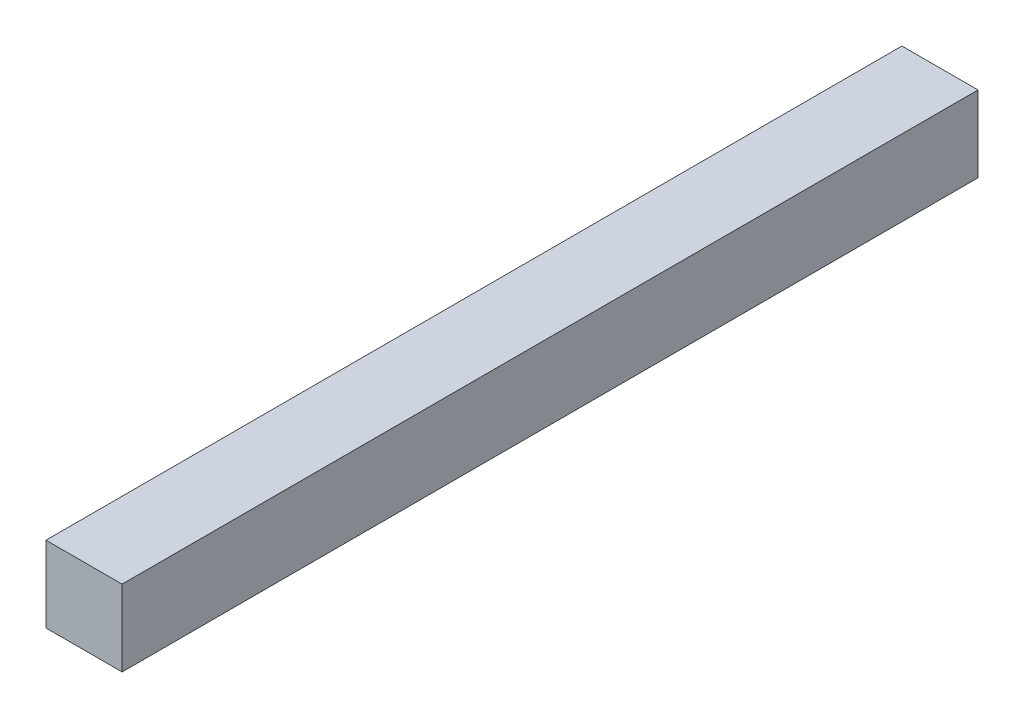
ISO-10303-21;
HEADER;
FILE_DESCRIPTION(('STEP AP214'),'2;1');
FILE_NAME('part.step','',(''),(''),'','','');
FILE_SCHEMA(('AUTOMOTIVE_DESIGN { 1 0 10303 214 1 1 1 1 }'));
ENDSEC;
DATA;
#1=APPLICATION_CONTEXT('core data for automotive mechanical design processes');
#2=APPLICATION_PROTOCOL_DEFINITION('international standard','automotive_design',2000,#1);
#3=PRODUCT_CONTEXT('',#1,'mechanical');
#4=PRODUCT('Part','Part','',(#3));
#5=PRODUCT_RELATED_PRODUCT_CATEGORY('part','',(#4));
#6=PRODUCT_DEFINITION_FORMATION('','',#4);
#7=PRODUCT_DEFINITION_CONTEXT('part definition',#1,'design');
#8=PRODUCT_DEFINITION('design','',#6,#7);
#9=PRODUCT_DEFINITION_SHAPE('','',#8);
#10=(LENGTH_UNIT() NAMED_UNIT(*) SI_UNIT(.MILLI.,.METRE.));
#11=(NAMED_UNIT(*) PLANE_ANGLE_UNIT() SI_UNIT($,.RADIAN.));
#12=(NAMED_UNIT(*) SI_UNIT($,.STERADIAN.) SOLID_ANGLE_UNIT());
#13=UNCERTAINTY_MEASURE_WITH_UNIT(LENGTH_MEASURE(1.E-05),#10,'distance_accuracy_value','');
#14=(GEOMETRIC_REPRESENTATION_CONTEXT(3) GLOBAL_UNCERTAINTY_ASSIGNED_CONTEXT((#13)) GLOBAL_UNIT_ASSIGNED_CONTEXT((#10,
#11,#12)) REPRESENTATION_CONTEXT('',''));
#15=CARTESIAN_POINT('',(0.,0.,0.));
#16=DIRECTION('',(0.,0.,1.));
#17=DIRECTION('',(1.,0.,0.));
#18=AXIS2_PLACEMENT_3D('',#15,#16,#17);
#19=CARTESIAN_POINT('',(0.,0.,1000.));
#20=DIRECTION('',(1.,0.,0.));
#21=DIRECTION('',(0.,1.,0.));
#22=AXIS2_PLACEMENT_3D('',#19,#20,#21);
#23=PLANE('',#22);
#24=DIRECTION('',(0.,-1.,0.));
#25=VECTOR('',#24,1.);
#26=CARTESIAN_POINT('',(0.,0.,0.));
#27=LINE('',#26,#25);
#28=CARTESIAN_POINT('',(0.,0.,0.));
#29=VERTEX_POINT('',#28);
#30=CARTESIAN_POINT('',(0.,-88.9,0.));
#31=VERTEX_POINT('',#30);
#32=EDGE_CURVE('E100',#29,#31,#27,.T.);
#33=ORIENTED_EDGE('',*,*,#32,.T.);
#34=DIRECTION('',(0.,0.,-1.));
#35=VECTOR('',#34,1.);
#36=CARTESIAN_POINT('',(0.,-88.9,1000.));
#37=LINE('',#36,#35);
#38=CARTESIAN_POINT('',(0.,-88.9,1000.));
#39=VERTEX_POINT('',#38);
#40=EDGE_CURVE('E11',#39,#31,#37,.T.);
#41=ORIENTED_EDGE('',*,*,#40,.F.);
#42=DIRECTION('',(0.,-1.,0.));
#43=VECTOR('',#42,1.);
#44=CARTESIAN_POINT('',(0.,0.,1000.));
#45=LINE('',#44,#43);
#46=CARTESIAN_POINT('',(0.,0.,1000.));
#47=VERTEX_POINT('',#46);
#48=EDGE_CURVE('E88',#47,#39,#45,.T.);
#49=ORIENTED_EDGE('',*,*,#48,.F.);
#50=DIRECTION('',(0.,0.,-1.));
#51=VECTOR('',#50,1.);
#52=CARTESIAN_POINT('',(0.,0.,1000.));
#53=LINE('',#52,#51);
#54=EDGE_CURVE('E96',#47,#29,#53,.T.);
#55=ORIENTED_EDGE('',*,*,#54,.T.);
#56=EDGE_LOOP('',(#33,#41,#49,#55));
#57=FACE_BOUND('',#56,.T.);
#58=ADVANCED_FACE('F37',(#57),#23,.F.);
#59=CARTESIAN_POINT('',(0.,-88.9,1000.));
#60=DIRECTION('',(0.,1.,0.));
#61=DIRECTION('',(0.,0.,1.));
#62=AXIS2_PLACEMENT_3D('',#59,#60,#61);
#63=PLANE('',#62);
#64=DIRECTION('',(1.,0.,0.));
#65=VECTOR('',#64,1.);
#66=CARTESIAN_POINT('',(0.,-88.9,0.));
#67=LINE('',#66,#65);
#68=CARTESIAN_POINT('',(88.9,-88.9,0.));
#69=VERTEX_POINT('',#68);
#70=EDGE_CURVE('E92',#31,#69,#67,.T.);
#71=ORIENTED_EDGE('',*,*,#70,.T.);
#72=DIRECTION('',(0.,0.,-1.));
#73=VECTOR('',#72,1.);
#74=CARTESIAN_POINT('',(88.9,-88.9,1000.));
#75=LINE('',#74,#73);
#76=CARTESIAN_POINT('',(88.9,-88.9,1000.));
#77=VERTEX_POINT('',#76);
#78=EDGE_CURVE('E45',#77,#69,#75,.T.);
#79=ORIENTED_EDGE('',*,*,#78,.F.);
#80=DIRECTION('',(1.,0.,0.));
#81=VECTOR('',#80,1.);
#82=CARTESIAN_POINT('',(0.,-88.9,1000.));
#83=LINE('',#82,#81);
#84=EDGE_CURVE('E83',#39,#77,#83,.T.);
#85=ORIENTED_EDGE('',*,*,#84,.F.);
#86=ORIENTED_EDGE('',*,*,#40,.T.);
#87=EDGE_LOOP('',(#71,#79,#85,#86));
#88=FACE_BOUND('',#87,.T.);
#89=ADVANCED_FACE('F91',(#88),#63,.F.);
#90=CARTESIAN_POINT('',(88.9,0.,1000.));
#91=DIRECTION('',(-1.,0.,0.));
#92=DIRECTION('',(0.,-1.,0.));
#93=AXIS2_PLACEMENT_3D('',#90,#91,#92);
#94=PLANE('',#93);
#95=DIRECTION('',(0.,1.,0.));
#96=VECTOR('',#95,1.);
#97=CARTESIAN_POINT('',(88.9,0.,0.));
#98=LINE('',#97,#96);
#99=CARTESIAN_POINT('',(88.9,0.,0.));
#100=VERTEX_POINT('',#99);
#101=EDGE_CURVE('E70',#69,#100,#98,.T.);
#102=ORIENTED_EDGE('',*,*,#101,.T.);
#103=DIRECTION('',(0.,0.,-1.));
#104=VECTOR('',#103,1.);
#105=CARTESIAN_POINT('',(88.9,0.,1000.));
#106=LINE('',#105,#104);
#107=CARTESIAN_POINT('',(88.9,0.,1000.));
#108=VERTEX_POINT('',#107);
#109=EDGE_CURVE('E93',#108,#100,#106,.T.);
#110=ORIENTED_EDGE('',*,*,#109,.F.);
#111=DIRECTION('',(0.,1.,0.));
#112=VECTOR('',#111,1.);
#113=CARTESIAN_POINT('',(88.9,0.,1000.));
#114=LINE('',#113,#112);
#115=EDGE_CURVE('E86',#77,#108,#114,.T.);
#116=ORIENTED_EDGE('',*,*,#115,.F.);
#117=ORIENTED_EDGE('',*,*,#78,.T.);
#118=EDGE_LOOP('',(#102,#110,#116,#117));
#119=FACE_BOUND('',#118,.T.);
#120=ADVANCED_FACE('F94',(#119),#94,.F.);
#121=CARTESIAN_POINT('',(0.,0.,1000.));
#122=DIRECTION('',(0.,-1.,0.));
#123=DIRECTION('',(0.,0.,-1.));
#124=AXIS2_PLACEMENT_3D('',#121,#122,#123);
#125=PLANE('',#124);
#126=DIRECTION('',(-1.,0.,0.));
#127=VECTOR('',#126,1.);
#128=CARTESIAN_POINT('',(0.,0.,0.));
#129=LINE('',#128,#127);
#130=EDGE_CURVE('E76',#100,#29,#129,.T.);
#131=ORIENTED_EDGE('',*,*,#130,.T.);
#132=ORIENTED_EDGE('',*,*,#54,.F.);
#133=DIRECTION('',(-1.,0.,0.));
#134=VECTOR('',#133,1.);
#135=CARTESIAN_POINT('',(0.,0.,1000.));
#136=LINE('',#135,#134);
#137=EDGE_CURVE('E53',#108,#47,#136,.T.);
#138=ORIENTED_EDGE('',*,*,#137,.F.);
#139=ORIENTED_EDGE('',*,*,#109,.T.);
#140=EDGE_LOOP('',(#131,#132,#138,#139));
#141=FACE_BOUND('',#140,.T.);
#142=ADVANCED_FACE('F107',(#141),#125,.F.);
#143=CARTESIAN_POINT('',(0.,0.,1000.));
#144=DIRECTION('',(0.,0.,1.));
#145=DIRECTION('',(1.,0.,0.));
#146=AXIS2_PLACEMENT_3D('',#143,#144,#145);
#147=PLANE('',#146);
#148=ORIENTED_EDGE('',*,*,#48,.T.);
#149=ORIENTED_EDGE('',*,*,#84,.T.);
#150=ORIENTED_EDGE('',*,*,#115,.T.);
#151=ORIENTED_EDGE('',*,*,#137,.T.);
#152=EDGE_LOOP('',(#148,#149,#150,#151));
#153=FACE_BOUND('',#152,.T.);
#154=ADVANCED_FACE('F84',(#153),#147,.T.);
#155=CARTESIAN_POINT('',(0.,0.,0.));
#156=DIRECTION('',(0.,0.,1.));
#157=DIRECTION('',(1.,0.,0.));
#158=AXIS2_PLACEMENT_3D('',#155,#156,#157);
#159=PLANE('',#158);
#160=ORIENTED_EDGE('',*,*,#32,.F.);
#161=ORIENTED_EDGE('',*,*,#130,.F.);
#162=ORIENTED_EDGE('',*,*,#101,.F.);
#163=ORIENTED_EDGE('',*,*,#70,.F.);
#164=EDGE_LOOP('',(#160,#161,#162,#163));
#165=FACE_BOUND('',#164,.T.);
#166=ADVANCED_FACE('F110',(#165),#159,.F.);
#167=CLOSED_SHELL('',(#58,#89,#120,#142,#154,#166));
#168=MANIFOLD_SOLID_BREP('B2',#167);
#169=ADVANCED_BREP_SHAPE_REPRESENTATION('',(#18,#168),#14);
#170=SHAPE_DEFINITION_REPRESENTATION(#9,#169);
ENDSEC;
END-ISO-10303-21;
